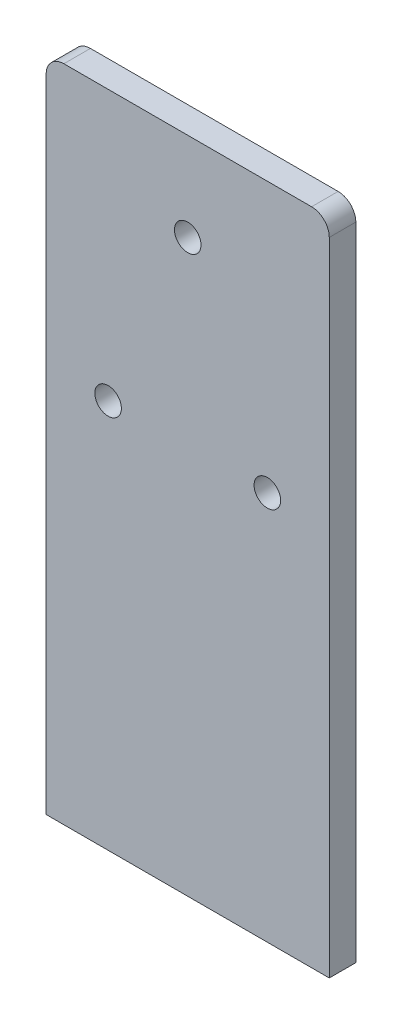
ISO-10303-21;
HEADER;
FILE_DESCRIPTION(('STEP AP214'),'2;1');
FILE_NAME('part.step','',(''),(''),'','','');
FILE_SCHEMA(('AUTOMOTIVE_DESIGN { 1 0 10303 214 1 1 1 1 }'));
ENDSEC;
DATA;
#1=APPLICATION_CONTEXT('core data for automotive mechanical design processes');
#2=APPLICATION_PROTOCOL_DEFINITION('international standard','automotive_design',2000,#1);
#3=PRODUCT_CONTEXT('',#1,'mechanical');
#4=PRODUCT('Part','Part','',(#3));
#5=PRODUCT_RELATED_PRODUCT_CATEGORY('part','',(#4));
#6=PRODUCT_DEFINITION_FORMATION('','',#4);
#7=PRODUCT_DEFINITION_CONTEXT('part definition',#1,'design');
#8=PRODUCT_DEFINITION('design','',#6,#7);
#9=PRODUCT_DEFINITION_SHAPE('','',#8);
#10=(LENGTH_UNIT() NAMED_UNIT(*) SI_UNIT(.MILLI.,.METRE.));
#11=(NAMED_UNIT(*) PLANE_ANGLE_UNIT() SI_UNIT($,.RADIAN.));
#12=(NAMED_UNIT(*) SI_UNIT($,.STERADIAN.) SOLID_ANGLE_UNIT());
#13=UNCERTAINTY_MEASURE_WITH_UNIT(LENGTH_MEASURE(1.E-05),#10,'distance_accuracy_value','');
#14=(GEOMETRIC_REPRESENTATION_CONTEXT(3) GLOBAL_UNCERTAINTY_ASSIGNED_CONTEXT((#13)) GLOBAL_UNIT_ASSIGNED_CONTEXT((#10,
#11,#12)) REPRESENTATION_CONTEXT('',''));
#15=CARTESIAN_POINT('',(0.,0.,0.));
#16=DIRECTION('',(0.,0.,1.));
#17=DIRECTION('',(1.,0.,0.));
#18=AXIS2_PLACEMENT_3D('',#15,#16,#17);
#19=CARTESIAN_POINT('',(0.,0.,1.5));
#20=DIRECTION('',(0.,0.,1.));
#21=DIRECTION('',(1.,0.,0.));
#22=AXIS2_PLACEMENT_3D('',#19,#20,#21);
#23=PLANE('',#22);
#24=CARTESIAN_POINT('',(-9.00000000000001,6.75000000000001,1.5));
#25=DIRECTION('',(0.,0.,1.));
#26=DIRECTION('',(1.,0.,0.));
#27=AXIS2_PLACEMENT_3D('',#24,#25,#26);
#28=CIRCLE('',#27,1.5);
#29=CARTESIAN_POINT('',(-7.50000000000001,6.75000000000001,1.5));
#30=VERTEX_POINT('',#29);
#31=EDGE_CURVE('E158',#30,#30,#28,.T.);
#32=ORIENTED_EDGE('',*,*,#31,.F.);
#33=EDGE_LOOP('',(#32));
#34=FACE_BOUND('',#33,.T.);
#35=DIRECTION('',(0.,1.,0.));
#36=VECTOR('',#35,1.);
#37=CARTESIAN_POINT('',(16.,37.25,1.5));
#38=LINE('',#37,#36);
#39=CARTESIAN_POINT('',(16.,-37.25,1.5));
#40=VERTEX_POINT('',#39);
#41=CARTESIAN_POINT('',(16.,35.25,1.5));
#42=VERTEX_POINT('',#41);
#43=EDGE_CURVE('E128',#40,#42,#38,.T.);
#44=ORIENTED_EDGE('',*,*,#43,.T.);
#45=CARTESIAN_POINT('',(14.,35.25,1.5));
#46=DIRECTION('',(0.,0.,1.));
#47=DIRECTION('',(1.,0.,0.));
#48=AXIS2_PLACEMENT_3D('',#45,#46,#47);
#49=CIRCLE('',#48,2.);
#50=CARTESIAN_POINT('',(14.,37.25,1.5));
#51=VERTEX_POINT('',#50);
#52=EDGE_CURVE('E49',#42,#51,#49,.T.);
#53=ORIENTED_EDGE('',*,*,#52,.T.);
#54=DIRECTION('',(-1.,0.,0.));
#55=VECTOR('',#54,1.);
#56=CARTESIAN_POINT('',(-16.,37.25,1.5));
#57=LINE('',#56,#55);
#58=CARTESIAN_POINT('',(-14.,37.25,1.5));
#59=VERTEX_POINT('',#58);
#60=EDGE_CURVE('E102',#51,#59,#57,.T.);
#61=ORIENTED_EDGE('',*,*,#60,.T.);
#62=CARTESIAN_POINT('',(-14.,35.25,1.5));
#63=DIRECTION('',(0.,0.,1.));
#64=DIRECTION('',(1.,0.,0.));
#65=AXIS2_PLACEMENT_3D('',#62,#63,#64);
#66=CIRCLE('',#65,2.);
#67=CARTESIAN_POINT('',(-16.,35.25,1.5));
#68=VERTEX_POINT('',#67);
#69=EDGE_CURVE('E56',#59,#68,#66,.T.);
#70=ORIENTED_EDGE('',*,*,#69,.T.);
#71=DIRECTION('',(0.,-1.,0.));
#72=VECTOR('',#71,1.);
#73=CARTESIAN_POINT('',(-16.,37.25,1.5));
#74=LINE('',#73,#72);
#75=CARTESIAN_POINT('',(-16.,-37.25,1.5));
#76=VERTEX_POINT('',#75);
#77=EDGE_CURVE('E94',#68,#76,#74,.T.);
#78=ORIENTED_EDGE('',*,*,#77,.T.);
#79=DIRECTION('',(1.,0.,0.));
#80=VECTOR('',#79,1.);
#81=CARTESIAN_POINT('',(-16.,-37.25,1.5));
#82=LINE('',#81,#80);
#83=EDGE_CURVE('E98',#76,#40,#82,.T.);
#84=ORIENTED_EDGE('',*,*,#83,.T.);
#85=EDGE_LOOP('',(#44,#53,#61,#70,#78,#84));
#86=FACE_BOUND('',#85,.T.);
#87=CARTESIAN_POINT('',(0.,27.25,1.5));
#88=DIRECTION('',(0.,0.,1.));
#89=DIRECTION('',(1.,0.,0.));
#90=AXIS2_PLACEMENT_3D('',#87,#88,#89);
#91=CIRCLE('',#90,1.5);
#92=CARTESIAN_POINT('',(1.49999999999999,27.25,1.5));
#93=VERTEX_POINT('',#92);
#94=EDGE_CURVE('E123',#93,#93,#91,.T.);
#95=ORIENTED_EDGE('',*,*,#94,.F.);
#96=EDGE_LOOP('',(#95));
#97=FACE_BOUND('',#96,.T.);
#98=CARTESIAN_POINT('',(8.99999999999999,6.75000000000001,1.5));
#99=DIRECTION('',(0.,0.,1.));
#100=DIRECTION('',(1.,0.,0.));
#101=AXIS2_PLACEMENT_3D('',#98,#99,#100);
#102=CIRCLE('',#101,1.5);
#103=CARTESIAN_POINT('',(10.5,6.75000000000001,1.5));
#104=VERTEX_POINT('',#103);
#105=EDGE_CURVE('E164',#104,#104,#102,.T.);
#106=ORIENTED_EDGE('',*,*,#105,.F.);
#107=EDGE_LOOP('',(#106));
#108=FACE_BOUND('',#107,.T.);
#109=ADVANCED_FACE('F41',(#34,#86,#97,#108),#23,.T.);
#110=CARTESIAN_POINT('',(0.,0.,-1.5));
#111=DIRECTION('',(0.,0.,1.));
#112=DIRECTION('',(1.,0.,0.));
#113=AXIS2_PLACEMENT_3D('',#110,#111,#112);
#114=PLANE('',#113);
#115=DIRECTION('',(-1.,0.,0.));
#116=VECTOR('',#115,1.);
#117=CARTESIAN_POINT('',(-16.,37.25,-1.5));
#118=LINE('',#117,#116);
#119=CARTESIAN_POINT('',(14.,37.25,-1.5));
#120=VERTEX_POINT('',#119);
#121=CARTESIAN_POINT('',(-14.,37.25,-1.5));
#122=VERTEX_POINT('',#121);
#123=EDGE_CURVE('E122',#120,#122,#118,.T.);
#124=ORIENTED_EDGE('',*,*,#123,.F.);
#125=CARTESIAN_POINT('',(14.,35.25,-1.5));
#126=DIRECTION('',(0.,0.,1.));
#127=DIRECTION('',(1.,0.,0.));
#128=AXIS2_PLACEMENT_3D('',#125,#126,#127);
#129=CIRCLE('',#128,2.);
#130=CARTESIAN_POINT('',(16.,35.25,-1.5));
#131=VERTEX_POINT('',#130);
#132=EDGE_CURVE('E136',#120,#131,#129,.F.);
#133=ORIENTED_EDGE('',*,*,#132,.T.);
#134=DIRECTION('',(0.,1.,0.));
#135=VECTOR('',#134,1.);
#136=CARTESIAN_POINT('',(16.,37.25,-1.5));
#137=LINE('',#136,#135);
#138=CARTESIAN_POINT('',(16.,-37.25,-1.5));
#139=VERTEX_POINT('',#138);
#140=EDGE_CURVE('E120',#139,#131,#137,.T.);
#141=ORIENTED_EDGE('',*,*,#140,.F.);
#142=DIRECTION('',(1.,0.,0.));
#143=VECTOR('',#142,1.);
#144=CARTESIAN_POINT('',(-16.,-37.25,-1.5));
#145=LINE('',#144,#143);
#146=CARTESIAN_POINT('',(-16.,-37.25,-1.5));
#147=VERTEX_POINT('',#146);
#148=EDGE_CURVE('E127',#147,#139,#145,.T.);
#149=ORIENTED_EDGE('',*,*,#148,.F.);
#150=DIRECTION('',(0.,-1.,0.));
#151=VECTOR('',#150,1.);
#152=CARTESIAN_POINT('',(-16.,37.25,-1.5));
#153=LINE('',#152,#151);
#154=CARTESIAN_POINT('',(-16.,35.25,-1.5));
#155=VERTEX_POINT('',#154);
#156=EDGE_CURVE('E108',#155,#147,#153,.T.);
#157=ORIENTED_EDGE('',*,*,#156,.F.);
#158=CARTESIAN_POINT('',(-14.,35.25,-1.5));
#159=DIRECTION('',(0.,0.,1.));
#160=DIRECTION('',(1.,0.,0.));
#161=AXIS2_PLACEMENT_3D('',#158,#159,#160);
#162=CIRCLE('',#161,2.);
#163=EDGE_CURVE('E134',#155,#122,#162,.F.);
#164=ORIENTED_EDGE('',*,*,#163,.T.);
#165=EDGE_LOOP('',(#124,#133,#141,#149,#157,#164));
#166=FACE_BOUND('',#165,.T.);
#167=CARTESIAN_POINT('',(0.,27.25,-1.5));
#168=DIRECTION('',(0.,0.,1.));
#169=DIRECTION('',(1.,0.,0.));
#170=AXIS2_PLACEMENT_3D('',#167,#168,#169);
#171=CIRCLE('',#170,1.5);
#172=CARTESIAN_POINT('',(1.49999999999999,27.25,-1.5));
#173=VERTEX_POINT('',#172);
#174=EDGE_CURVE('E155',#173,#173,#171,.T.);
#175=ORIENTED_EDGE('',*,*,#174,.T.);
#176=EDGE_LOOP('',(#175));
#177=FACE_BOUND('',#176,.T.);
#178=CARTESIAN_POINT('',(-9.00000000000001,6.75000000000001,-1.5));
#179=DIRECTION('',(0.,0.,1.));
#180=DIRECTION('',(1.,0.,0.));
#181=AXIS2_PLACEMENT_3D('',#178,#179,#180);
#182=CIRCLE('',#181,1.5);
#183=CARTESIAN_POINT('',(-7.50000000000001,6.75000000000001,-1.5));
#184=VERTEX_POINT('',#183);
#185=EDGE_CURVE('E161',#184,#184,#182,.T.);
#186=ORIENTED_EDGE('',*,*,#185,.T.);
#187=EDGE_LOOP('',(#186));
#188=FACE_BOUND('',#187,.T.);
#189=CARTESIAN_POINT('',(8.99999999999999,6.75000000000001,-1.5));
#190=DIRECTION('',(0.,0.,1.));
#191=DIRECTION('',(1.,0.,0.));
#192=AXIS2_PLACEMENT_3D('',#189,#190,#191);
#193=CIRCLE('',#192,1.5);
#194=CARTESIAN_POINT('',(10.5,6.75000000000001,-1.5));
#195=VERTEX_POINT('',#194);
#196=EDGE_CURVE('E167',#195,#195,#193,.T.);
#197=ORIENTED_EDGE('',*,*,#196,.T.);
#198=EDGE_LOOP('',(#197));
#199=FACE_BOUND('',#198,.T.);
#200=ADVANCED_FACE('F150',(#166,#177,#188,#199),#114,.F.);
#201=CARTESIAN_POINT('',(16.,37.25,1.5));
#202=DIRECTION('',(-1.,0.,0.));
#203=DIRECTION('',(0.,-1.,0.));
#204=AXIS2_PLACEMENT_3D('',#201,#202,#203);
#205=PLANE('',#204);
#206=ORIENTED_EDGE('',*,*,#140,.T.);
#207=DIRECTION('',(0.,0.,-1.));
#208=VECTOR('',#207,1.);
#209=CARTESIAN_POINT('',(16.,35.25,1.5));
#210=LINE('',#209,#208);
#211=EDGE_CURVE('E64',#131,#42,#210,.F.);
#212=ORIENTED_EDGE('',*,*,#211,.T.);
#213=ORIENTED_EDGE('',*,*,#43,.F.);
#214=DIRECTION('',(0.,0.,-1.));
#215=VECTOR('',#214,1.);
#216=CARTESIAN_POINT('',(16.,-37.25,1.5));
#217=LINE('',#216,#215);
#218=EDGE_CURVE('E112',#40,#139,#217,.T.);
#219=ORIENTED_EDGE('',*,*,#218,.T.);
#220=EDGE_LOOP('',(#206,#212,#213,#219));
#221=FACE_BOUND('',#220,.T.);
#222=ADVANCED_FACE('F152',(#221),#205,.F.);
#223=CARTESIAN_POINT('',(-16.,37.25,1.5));
#224=DIRECTION('',(0.,-1.,0.));
#225=DIRECTION('',(0.,0.,-1.));
#226=AXIS2_PLACEMENT_3D('',#223,#224,#225);
#227=PLANE('',#226);
#228=ORIENTED_EDGE('',*,*,#60,.F.);
#229=DIRECTION('',(0.,0.,-1.));
#230=VECTOR('',#229,1.);
#231=CARTESIAN_POINT('',(14.,37.25,1.5));
#232=LINE('',#231,#230);
#233=EDGE_CURVE('E131',#51,#120,#232,.T.);
#234=ORIENTED_EDGE('',*,*,#233,.T.);
#235=ORIENTED_EDGE('',*,*,#123,.T.);
#236=DIRECTION('',(0.,0.,-1.));
#237=VECTOR('',#236,1.);
#238=CARTESIAN_POINT('',(-14.,37.25,1.5));
#239=LINE('',#238,#237);
#240=EDGE_CURVE('E111',#122,#59,#239,.F.);
#241=ORIENTED_EDGE('',*,*,#240,.T.);
#242=EDGE_LOOP('',(#228,#234,#235,#241));
#243=FACE_BOUND('',#242,.T.);
#244=ADVANCED_FACE('F144',(#243),#227,.F.);
#245=CARTESIAN_POINT('',(-16.,37.25,1.5));
#246=DIRECTION('',(1.,0.,0.));
#247=DIRECTION('',(0.,1.,0.));
#248=AXIS2_PLACEMENT_3D('',#245,#246,#247);
#249=PLANE('',#248);
#250=ORIENTED_EDGE('',*,*,#77,.F.);
#251=DIRECTION('',(0.,0.,-1.));
#252=VECTOR('',#251,1.);
#253=CARTESIAN_POINT('',(-16.,35.25,1.5));
#254=LINE('',#253,#252);
#255=EDGE_CURVE('E11',#68,#155,#254,.T.);
#256=ORIENTED_EDGE('',*,*,#255,.T.);
#257=ORIENTED_EDGE('',*,*,#156,.T.);
#258=DIRECTION('',(0.,0.,-1.));
#259=VECTOR('',#258,1.);
#260=CARTESIAN_POINT('',(-16.,-37.25,1.5));
#261=LINE('',#260,#259);
#262=EDGE_CURVE('E105',#76,#147,#261,.T.);
#263=ORIENTED_EDGE('',*,*,#262,.F.);
#264=EDGE_LOOP('',(#250,#256,#257,#263));
#265=FACE_BOUND('',#264,.T.);
#266=ADVANCED_FACE('F106',(#265),#249,.F.);
#267=CARTESIAN_POINT('',(-16.,-37.25,1.5));
#268=DIRECTION('',(0.,1.,0.));
#269=DIRECTION('',(0.,0.,1.));
#270=AXIS2_PLACEMENT_3D('',#267,#268,#269);
#271=PLANE('',#270);
#272=ORIENTED_EDGE('',*,*,#148,.T.);
#273=ORIENTED_EDGE('',*,*,#218,.F.);
#274=ORIENTED_EDGE('',*,*,#83,.F.);
#275=ORIENTED_EDGE('',*,*,#262,.T.);
#276=EDGE_LOOP('',(#272,#273,#274,#275));
#277=FACE_BOUND('',#276,.T.);
#278=ADVANCED_FACE('F114',(#277),#271,.F.);
#279=CARTESIAN_POINT('',(0.,27.25,1.5));
#280=DIRECTION('',(0.,0.,-1.));
#281=DIRECTION('',(-1.,0.,0.));
#282=AXIS2_PLACEMENT_3D('',#279,#280,#281);
#283=CYLINDRICAL_SURFACE('',#282,1.5);
#284=ORIENTED_EDGE('',*,*,#94,.T.);
#285=EDGE_LOOP('',(#284));
#286=FACE_BOUND('',#285,.T.);
#287=ORIENTED_EDGE('',*,*,#174,.F.);
#288=EDGE_LOOP('',(#287));
#289=FACE_BOUND('',#288,.T.);
#290=ADVANCED_FACE('F186',(#286,#289),#283,.F.);
#291=CARTESIAN_POINT('',(-9.00000000000001,6.75000000000001,1.5));
#292=DIRECTION('',(0.,0.,-1.));
#293=DIRECTION('',(-1.,0.,0.));
#294=AXIS2_PLACEMENT_3D('',#291,#292,#293);
#295=CYLINDRICAL_SURFACE('',#294,1.5);
#296=ORIENTED_EDGE('',*,*,#31,.T.);
#297=EDGE_LOOP('',(#296));
#298=FACE_BOUND('',#297,.T.);
#299=ORIENTED_EDGE('',*,*,#185,.F.);
#300=EDGE_LOOP('',(#299));
#301=FACE_BOUND('',#300,.T.);
#302=ADVANCED_FACE('F201',(#298,#301),#295,.F.);
#303=CARTESIAN_POINT('',(8.99999999999999,6.75000000000001,1.5));
#304=DIRECTION('',(0.,0.,-1.));
#305=DIRECTION('',(-1.,0.,0.));
#306=AXIS2_PLACEMENT_3D('',#303,#304,#305);
#307=CYLINDRICAL_SURFACE('',#306,1.5);
#308=ORIENTED_EDGE('',*,*,#105,.T.);
#309=EDGE_LOOP('',(#308));
#310=FACE_BOUND('',#309,.T.);
#311=ORIENTED_EDGE('',*,*,#196,.F.);
#312=EDGE_LOOP('',(#311));
#313=FACE_BOUND('',#312,.T.);
#314=ADVANCED_FACE('F173',(#310,#313),#307,.F.);
#315=CARTESIAN_POINT('',(14.,35.25,1.5));
#316=DIRECTION('',(0.,0.,-1.));
#317=DIRECTION('',(-1.,0.,0.));
#318=AXIS2_PLACEMENT_3D('',#315,#316,#317);
#319=CYLINDRICAL_SURFACE('',#318,2.);
#320=ORIENTED_EDGE('',*,*,#52,.F.);
#321=ORIENTED_EDGE('',*,*,#211,.F.);
#322=ORIENTED_EDGE('',*,*,#132,.F.);
#323=ORIENTED_EDGE('',*,*,#233,.F.);
#324=EDGE_LOOP('',(#320,#321,#322,#323));
#325=FACE_BOUND('',#324,.T.);
#326=ADVANCED_FACE('F147',(#325),#319,.T.);
#327=CARTESIAN_POINT('',(-14.,35.25,1.5));
#328=DIRECTION('',(0.,0.,-1.));
#329=DIRECTION('',(-1.,0.,0.));
#330=AXIS2_PLACEMENT_3D('',#327,#328,#329);
#331=CYLINDRICAL_SURFACE('',#330,2.);
#332=ORIENTED_EDGE('',*,*,#69,.F.);
#333=ORIENTED_EDGE('',*,*,#240,.F.);
#334=ORIENTED_EDGE('',*,*,#163,.F.);
#335=ORIENTED_EDGE('',*,*,#255,.F.);
#336=EDGE_LOOP('',(#332,#333,#334,#335));
#337=FACE_BOUND('',#336,.T.);
#338=ADVANCED_FACE('F43',(#337),#331,.T.);
#339=CLOSED_SHELL('',(#109,#200,#222,#244,#266,#278,#290,#302,#314,#326,#338));
#340=MANIFOLD_SOLID_BREP('B2',#339);
#341=ADVANCED_BREP_SHAPE_REPRESENTATION('',(#18,#340),#14);
#342=SHAPE_DEFINITION_REPRESENTATION(#9,#341);
ENDSEC;
END-ISO-10303-21;
